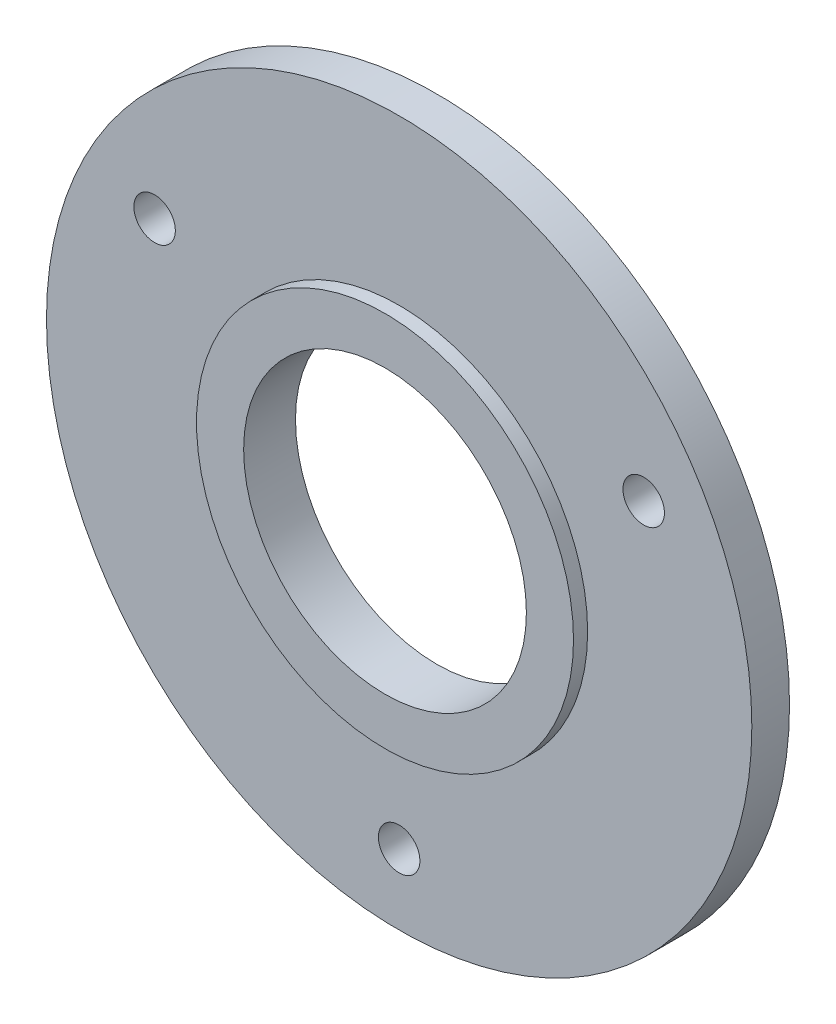
ISO-10303-21;
HEADER;
FILE_DESCRIPTION(('STEP AP214'),'2;1');
FILE_NAME('part.step','',(''),(''),'','','');
FILE_SCHEMA(('AUTOMOTIVE_DESIGN { 1 0 10303 214 1 1 1 1 }'));
ENDSEC;
DATA;
#1=APPLICATION_CONTEXT('core data for automotive mechanical design processes');
#2=APPLICATION_PROTOCOL_DEFINITION('international standard','automotive_design',2000,#1);
#3=PRODUCT_CONTEXT('',#1,'mechanical');
#4=PRODUCT('Part','Part','',(#3));
#5=PRODUCT_RELATED_PRODUCT_CATEGORY('part','',(#4));
#6=PRODUCT_DEFINITION_FORMATION('','',#4);
#7=PRODUCT_DEFINITION_CONTEXT('part definition',#1,'design');
#8=PRODUCT_DEFINITION('design','',#6,#7);
#9=PRODUCT_DEFINITION_SHAPE('','',#8);
#10=(LENGTH_UNIT() NAMED_UNIT(*) SI_UNIT(.MILLI.,.METRE.));
#11=(NAMED_UNIT(*) PLANE_ANGLE_UNIT() SI_UNIT($,.RADIAN.));
#12=(NAMED_UNIT(*) SI_UNIT($,.STERADIAN.) SOLID_ANGLE_UNIT());
#13=UNCERTAINTY_MEASURE_WITH_UNIT(LENGTH_MEASURE(1.E-05),#10,'distance_accuracy_value','');
#14=(GEOMETRIC_REPRESENTATION_CONTEXT(3) GLOBAL_UNCERTAINTY_ASSIGNED_CONTEXT((#13)) GLOBAL_UNIT_ASSIGNED_CONTEXT((#10,
#11,#12)) REPRESENTATION_CONTEXT('',''));
#15=CARTESIAN_POINT('',(0.,0.,0.));
#16=DIRECTION('',(0.,0.,1.));
#17=DIRECTION('',(1.,0.,0.));
#18=AXIS2_PLACEMENT_3D('',#15,#16,#17);
#19=CARTESIAN_POINT('',(0.,0.,2.));
#20=DIRECTION('',(0.,0.,1.));
#21=DIRECTION('',(1.,0.,0.));
#22=AXIS2_PLACEMENT_3D('',#19,#20,#21);
#23=PLANE('',#22);
#24=CARTESIAN_POINT('',(12.9730605486909,7.49000000000001,2.));
#25=DIRECTION('',(0.,0.,1.));
#26=DIRECTION('',(1.,0.,0.));
#27=AXIS2_PLACEMENT_3D('',#24,#25,#26);
#28=CIRCLE('',#27,1.1);
#29=CARTESIAN_POINT('',(14.0730605486909,7.49000000000001,2.));
#30=VERTEX_POINT('',#29);
#31=EDGE_CURVE('E58',#30,#30,#28,.T.);
#32=ORIENTED_EDGE('',*,*,#31,.F.);
#33=EDGE_LOOP('',(#32));
#34=FACE_BOUND('',#33,.T.);
#35=CARTESIAN_POINT('',(-12.9730605486909,7.49,2.));
#36=DIRECTION('',(0.,0.,1.));
#37=DIRECTION('',(1.,0.,0.));
#38=AXIS2_PLACEMENT_3D('',#35,#36,#37);
#39=CIRCLE('',#38,1.1);
#40=CARTESIAN_POINT('',(-11.8730605486909,7.49,2.));
#41=VERTEX_POINT('',#40);
#42=EDGE_CURVE('E47',#41,#41,#39,.T.);
#43=ORIENTED_EDGE('',*,*,#42,.F.);
#44=EDGE_LOOP('',(#43));
#45=FACE_BOUND('',#44,.T.);
#46=CARTESIAN_POINT('',(0.,0.,2.));
#47=DIRECTION('',(0.,0.,1.));
#48=DIRECTION('',(1.,0.,0.));
#49=AXIS2_PLACEMENT_3D('',#46,#47,#48);
#50=CIRCLE('',#49,18.71);
#51=CARTESIAN_POINT('',(18.71,0.,2.));
#52=VERTEX_POINT('',#51);
#53=EDGE_CURVE('E10',#52,#52,#50,.T.);
#54=ORIENTED_EDGE('',*,*,#53,.T.);
#55=EDGE_LOOP('',(#54));
#56=FACE_BOUND('',#55,.T.);
#57=CARTESIAN_POINT('',(0.,-14.98,2.));
#58=DIRECTION('',(0.,0.,1.));
#59=DIRECTION('',(1.,0.,0.));
#60=AXIS2_PLACEMENT_3D('',#57,#58,#59);
#61=CIRCLE('',#60,1.1);
#62=CARTESIAN_POINT('',(1.1,-14.98,2.));
#63=VERTEX_POINT('',#62);
#64=EDGE_CURVE('E42',#63,#63,#61,.T.);
#65=ORIENTED_EDGE('',*,*,#64,.F.);
#66=EDGE_LOOP('',(#65));
#67=FACE_BOUND('',#66,.T.);
#68=CARTESIAN_POINT('',(0.,0.,2.));
#69=DIRECTION('',(0.,0.,1.));
#70=DIRECTION('',(1.,0.,0.));
#71=AXIS2_PLACEMENT_3D('',#68,#69,#70);
#72=CIRCLE('',#71,10.);
#73=CARTESIAN_POINT('',(10.,0.,2.));
#74=VERTEX_POINT('',#73);
#75=EDGE_CURVE('E65',#74,#74,#72,.T.);
#76=ORIENTED_EDGE('',*,*,#75,.F.);
#77=EDGE_LOOP('',(#76));
#78=FACE_BOUND('',#77,.T.);
#79=ADVANCED_FACE('F31',(#34,#45,#56,#67,#78),#23,.T.);
#80=CARTESIAN_POINT('',(0.,0.,0.));
#81=DIRECTION('',(0.,0.,1.));
#82=DIRECTION('',(1.,0.,0.));
#83=AXIS2_PLACEMENT_3D('',#80,#81,#82);
#84=PLANE('',#83);
#85=CARTESIAN_POINT('',(0.,0.,0.));
#86=DIRECTION('',(0.,0.,1.));
#87=DIRECTION('',(1.,0.,0.));
#88=AXIS2_PLACEMENT_3D('',#85,#86,#87);
#89=CIRCLE('',#88,18.71);
#90=CARTESIAN_POINT('',(18.71,0.,0.));
#91=VERTEX_POINT('',#90);
#92=EDGE_CURVE('E35',#91,#91,#89,.T.);
#93=ORIENTED_EDGE('',*,*,#92,.F.);
#94=EDGE_LOOP('',(#93));
#95=FACE_BOUND('',#94,.T.);
#96=CARTESIAN_POINT('',(0.,-14.98,0.));
#97=DIRECTION('',(0.,0.,1.));
#98=DIRECTION('',(1.,0.,0.));
#99=AXIS2_PLACEMENT_3D('',#96,#97,#98);
#100=CIRCLE('',#99,1.1);
#101=CARTESIAN_POINT('',(1.1,-14.98,0.));
#102=VERTEX_POINT('',#101);
#103=EDGE_CURVE('E44',#102,#102,#100,.T.);
#104=ORIENTED_EDGE('',*,*,#103,.T.);
#105=EDGE_LOOP('',(#104));
#106=FACE_BOUND('',#105,.T.);
#107=CARTESIAN_POINT('',(-12.9730605486909,7.49,0.));
#108=DIRECTION('',(0.,0.,1.));
#109=DIRECTION('',(1.,0.,0.));
#110=AXIS2_PLACEMENT_3D('',#107,#108,#109);
#111=CIRCLE('',#110,1.1);
#112=CARTESIAN_POINT('',(-11.8730605486909,7.49,0.));
#113=VERTEX_POINT('',#112);
#114=EDGE_CURVE('E50',#113,#113,#111,.T.);
#115=ORIENTED_EDGE('',*,*,#114,.T.);
#116=EDGE_LOOP('',(#115));
#117=FACE_BOUND('',#116,.T.);
#118=CARTESIAN_POINT('',(0.,0.,0.));
#119=DIRECTION('',(0.,0.,1.));
#120=DIRECTION('',(1.,0.,0.));
#121=AXIS2_PLACEMENT_3D('',#118,#119,#120);
#122=CIRCLE('',#121,7.5);
#123=CARTESIAN_POINT('',(7.5,0.,0.));
#124=VERTEX_POINT('',#123);
#125=EDGE_CURVE('E53',#124,#124,#122,.T.);
#126=ORIENTED_EDGE('',*,*,#125,.T.);
#127=EDGE_LOOP('',(#126));
#128=FACE_BOUND('',#127,.T.);
#129=CARTESIAN_POINT('',(12.9730605486909,7.49000000000001,0.));
#130=DIRECTION('',(0.,0.,1.));
#131=DIRECTION('',(1.,0.,0.));
#132=AXIS2_PLACEMENT_3D('',#129,#130,#131);
#133=CIRCLE('',#132,1.1);
#134=CARTESIAN_POINT('',(14.0730605486909,7.49000000000001,0.));
#135=VERTEX_POINT('',#134);
#136=EDGE_CURVE('E59',#135,#135,#133,.T.);
#137=ORIENTED_EDGE('',*,*,#136,.T.);
#138=EDGE_LOOP('',(#137));
#139=FACE_BOUND('',#138,.T.);
#140=ADVANCED_FACE('F91',(#95,#106,#117,#128,#139),#84,.F.);
#141=CARTESIAN_POINT('',(0.,0.,2.));
#142=DIRECTION('',(0.,0.,-1.));
#143=DIRECTION('',(-1.,0.,0.));
#144=AXIS2_PLACEMENT_3D('',#141,#142,#143);
#145=CYLINDRICAL_SURFACE('',#144,18.71);
#146=ORIENTED_EDGE('',*,*,#53,.F.);
#147=EDGE_LOOP('',(#146));
#148=FACE_BOUND('',#147,.T.);
#149=ORIENTED_EDGE('',*,*,#92,.T.);
#150=EDGE_LOOP('',(#149));
#151=FACE_BOUND('',#150,.T.);
#152=ADVANCED_FACE('F33',(#148,#151),#145,.T.);
#153=CARTESIAN_POINT('',(0.,-14.98,2.));
#154=DIRECTION('',(0.,0.,-1.));
#155=DIRECTION('',(-1.,0.,0.));
#156=AXIS2_PLACEMENT_3D('',#153,#154,#155);
#157=CYLINDRICAL_SURFACE('',#156,1.1);
#158=ORIENTED_EDGE('',*,*,#64,.T.);
#159=EDGE_LOOP('',(#158));
#160=FACE_BOUND('',#159,.T.);
#161=ORIENTED_EDGE('',*,*,#103,.F.);
#162=EDGE_LOOP('',(#161));
#163=FACE_BOUND('',#162,.T.);
#164=ADVANCED_FACE('F101',(#160,#163),#157,.F.);
#165=CARTESIAN_POINT('',(-12.9730605486909,7.49,2.));
#166=DIRECTION('',(0.,0.,-1.));
#167=DIRECTION('',(-1.,0.,0.));
#168=AXIS2_PLACEMENT_3D('',#165,#166,#167);
#169=CYLINDRICAL_SURFACE('',#168,1.1);
#170=ORIENTED_EDGE('',*,*,#42,.T.);
#171=EDGE_LOOP('',(#170));
#172=FACE_BOUND('',#171,.T.);
#173=ORIENTED_EDGE('',*,*,#114,.F.);
#174=EDGE_LOOP('',(#173));
#175=FACE_BOUND('',#174,.T.);
#176=ADVANCED_FACE('F104',(#172,#175),#169,.F.);
#177=CARTESIAN_POINT('',(0.,0.,2.));
#178=DIRECTION('',(0.,0.,-1.));
#179=DIRECTION('',(-1.,0.,0.));
#180=AXIS2_PLACEMENT_3D('',#177,#178,#179);
#181=CYLINDRICAL_SURFACE('',#180,7.5);
#182=ORIENTED_EDGE('',*,*,#125,.F.);
#183=EDGE_LOOP('',(#182));
#184=FACE_BOUND('',#183,.T.);
#185=CARTESIAN_POINT('',(0.,0.,2.75));
#186=DIRECTION('',(0.,0.,1.));
#187=DIRECTION('',(1.,0.,0.));
#188=AXIS2_PLACEMENT_3D('',#185,#186,#187);
#189=CIRCLE('',#188,7.5);
#190=CARTESIAN_POINT('',(7.5,0.,2.75));
#191=VERTEX_POINT('',#190);
#192=EDGE_CURVE('E68',#191,#191,#189,.T.);
#193=ORIENTED_EDGE('',*,*,#192,.T.);
#194=EDGE_LOOP('',(#193));
#195=FACE_BOUND('',#194,.T.);
#196=ADVANCED_FACE('F74',(#184,#195),#181,.F.);
#197=CARTESIAN_POINT('',(12.9730605486909,7.49000000000001,2.));
#198=DIRECTION('',(0.,0.,-1.));
#199=DIRECTION('',(-1.,0.,0.));
#200=AXIS2_PLACEMENT_3D('',#197,#198,#199);
#201=CYLINDRICAL_SURFACE('',#200,1.1);
#202=ORIENTED_EDGE('',*,*,#31,.T.);
#203=EDGE_LOOP('',(#202));
#204=FACE_BOUND('',#203,.T.);
#205=ORIENTED_EDGE('',*,*,#136,.F.);
#206=EDGE_LOOP('',(#205));
#207=FACE_BOUND('',#206,.T.);
#208=ADVANCED_FACE('F79',(#204,#207),#201,.F.);
#209=CARTESIAN_POINT('',(0.,0.,2.75));
#210=DIRECTION('',(0.,0.,1.));
#211=DIRECTION('',(1.,0.,0.));
#212=AXIS2_PLACEMENT_3D('',#209,#210,#211);
#213=PLANE('',#212);
#214=CARTESIAN_POINT('',(0.,0.,2.75));
#215=DIRECTION('',(0.,0.,1.));
#216=DIRECTION('',(1.,0.,0.));
#217=AXIS2_PLACEMENT_3D('',#214,#215,#216);
#218=CIRCLE('',#217,10.);
#219=CARTESIAN_POINT('',(10.,0.,2.75));
#220=VERTEX_POINT('',#219);
#221=EDGE_CURVE('E62',#220,#220,#218,.T.);
#222=ORIENTED_EDGE('',*,*,#221,.T.);
#223=EDGE_LOOP('',(#222));
#224=FACE_BOUND('',#223,.T.);
#225=ORIENTED_EDGE('',*,*,#192,.F.);
#226=EDGE_LOOP('',(#225));
#227=FACE_BOUND('',#226,.T.);
#228=ADVANCED_FACE('F76',(#224,#227),#213,.T.);
#229=CARTESIAN_POINT('',(0.,0.,2.75));
#230=DIRECTION('',(0.,0.,-1.));
#231=DIRECTION('',(-1.,0.,0.));
#232=AXIS2_PLACEMENT_3D('',#229,#230,#231);
#233=CYLINDRICAL_SURFACE('',#232,10.);
#234=ORIENTED_EDGE('',*,*,#221,.F.);
#235=EDGE_LOOP('',(#234));
#236=FACE_BOUND('',#235,.T.);
#237=ORIENTED_EDGE('',*,*,#75,.T.);
#238=EDGE_LOOP('',(#237));
#239=FACE_BOUND('',#238,.T.);
#240=ADVANCED_FACE('F78',(#236,#239),#233,.T.);
#241=CLOSED_SHELL('',(#79,#140,#152,#164,#176,#196,#208,#228,#240));
#242=MANIFOLD_SOLID_BREP('B2',#241);
#243=ADVANCED_BREP_SHAPE_REPRESENTATION('',(#18,#242),#14);
#244=SHAPE_DEFINITION_REPRESENTATION(#9,#243);
ENDSEC;
END-ISO-10303-21;
